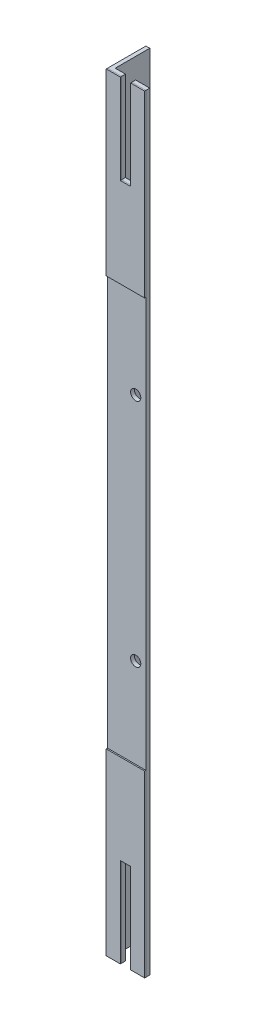
ISO-10303-21;
HEADER;
FILE_DESCRIPTION(('STEP AP214'),'2;1');
FILE_NAME('part.step','',(''),(''),'','','');
FILE_SCHEMA(('AUTOMOTIVE_DESIGN { 1 0 10303 214 1 1 1 1 }'));
ENDSEC;
DATA;
#1=APPLICATION_CONTEXT('core data for automotive mechanical design processes');
#2=APPLICATION_PROTOCOL_DEFINITION('international standard','automotive_design',2000,#1);
#3=PRODUCT_CONTEXT('',#1,'mechanical');
#4=PRODUCT('Part','Part','',(#3));
#5=PRODUCT_RELATED_PRODUCT_CATEGORY('part','',(#4));
#6=PRODUCT_DEFINITION_FORMATION('','',#4);
#7=PRODUCT_DEFINITION_CONTEXT('part definition',#1,'design');
#8=PRODUCT_DEFINITION('design','',#6,#7);
#9=PRODUCT_DEFINITION_SHAPE('','',#8);
#10=(LENGTH_UNIT() NAMED_UNIT(*) SI_UNIT(.MILLI.,.METRE.));
#11=(NAMED_UNIT(*) PLANE_ANGLE_UNIT() SI_UNIT($,.RADIAN.));
#12=(NAMED_UNIT(*) SI_UNIT($,.STERADIAN.) SOLID_ANGLE_UNIT());
#13=UNCERTAINTY_MEASURE_WITH_UNIT(LENGTH_MEASURE(1.E-05),#10,'distance_accuracy_value','');
#14=(GEOMETRIC_REPRESENTATION_CONTEXT(3) GLOBAL_UNCERTAINTY_ASSIGNED_CONTEXT((#13)) GLOBAL_UNIT_ASSIGNED_CONTEXT((#10,
#11,#12)) REPRESENTATION_CONTEXT('',''));
#15=CARTESIAN_POINT('',(0.,0.,0.));
#16=DIRECTION('',(0.,0.,1.));
#17=DIRECTION('',(1.,0.,0.));
#18=AXIS2_PLACEMENT_3D('',#15,#16,#17);
#19=CARTESIAN_POINT('',(30.,160.,1.));
#20=DIRECTION('',(-1.,0.,0.));
#21=DIRECTION('',(0.,0.,1.));
#22=AXIS2_PLACEMENT_3D('',#19,#20,#21);
#23=PLANE('',#22);
#24=DIRECTION('',(0.,1.,0.));
#25=VECTOR('',#24,1.);
#26=CARTESIAN_POINT('',(30.,160.,0.));
#27=LINE('',#26,#25);
#28=CARTESIAN_POINT('',(30.,160.,0.));
#29=VERTEX_POINT('',#28);
#30=CARTESIAN_POINT('',(30.,300.,0.));
#31=VERTEX_POINT('',#30);
#32=EDGE_CURVE('E144',#29,#31,#27,.T.);
#33=ORIENTED_EDGE('',*,*,#32,.T.);
#34=DIRECTION('',(0.,0.,-1.));
#35=VECTOR('',#34,1.);
#36=CARTESIAN_POINT('',(30.,300.,1.));
#37=LINE('',#36,#35);
#38=CARTESIAN_POINT('',(30.,300.,1.));
#39=VERTEX_POINT('',#38);
#40=EDGE_CURVE('E12',#39,#31,#37,.T.);
#41=ORIENTED_EDGE('',*,*,#40,.F.);
#42=DIRECTION('',(0.,1.,0.));
#43=VECTOR('',#42,1.);
#44=CARTESIAN_POINT('',(30.,160.,1.));
#45=LINE('',#44,#43);
#46=CARTESIAN_POINT('',(30.,160.,1.));
#47=VERTEX_POINT('',#46);
#48=EDGE_CURVE('E158',#47,#39,#45,.T.);
#49=ORIENTED_EDGE('',*,*,#48,.F.);
#50=DIRECTION('',(0.,0.,-1.));
#51=VECTOR('',#50,1.);
#52=CARTESIAN_POINT('',(30.,160.,1.));
#53=LINE('',#52,#51);
#54=EDGE_CURVE('E140',#47,#29,#53,.T.);
#55=ORIENTED_EDGE('',*,*,#54,.T.);
#56=EDGE_LOOP('',(#33,#41,#49,#55));
#57=FACE_BOUND('',#56,.T.);
#58=ADVANCED_FACE('F48',(#57),#23,.F.);
#59=CARTESIAN_POINT('',(30.,300.,1.));
#60=DIRECTION('',(0.,-1.,0.));
#61=DIRECTION('',(0.,0.,-1.));
#62=AXIS2_PLACEMENT_3D('',#59,#60,#61);
#63=PLANE('',#62);
#64=DIRECTION('',(-1.,0.,0.));
#65=VECTOR('',#64,1.);
#66=CARTESIAN_POINT('',(30.,300.,0.));
#67=LINE('',#66,#65);
#68=CARTESIAN_POINT('',(19.,300.,0.));
#69=VERTEX_POINT('',#68);
#70=EDGE_CURVE('E147',#31,#69,#67,.T.);
#71=ORIENTED_EDGE('',*,*,#70,.T.);
#72=DIRECTION('',(0.,0.,-1.));
#73=VECTOR('',#72,1.);
#74=CARTESIAN_POINT('',(19.,300.,1.));
#75=LINE('',#74,#73);
#76=CARTESIAN_POINT('',(19.,300.,1.));
#77=VERTEX_POINT('',#76);
#78=EDGE_CURVE('E56',#77,#69,#75,.T.);
#79=ORIENTED_EDGE('',*,*,#78,.F.);
#80=DIRECTION('',(-1.,0.,0.));
#81=VECTOR('',#80,1.);
#82=CARTESIAN_POINT('',(30.,300.,1.));
#83=LINE('',#82,#81);
#84=EDGE_CURVE('E107',#39,#77,#83,.T.);
#85=ORIENTED_EDGE('',*,*,#84,.F.);
#86=ORIENTED_EDGE('',*,*,#40,.T.);
#87=EDGE_LOOP('',(#71,#79,#85,#86));
#88=FACE_BOUND('',#87,.T.);
#89=ADVANCED_FACE('F193',(#88),#63,.F.);
#90=CARTESIAN_POINT('',(19.,300.,1.));
#91=DIRECTION('',(1.,0.,0.));
#92=DIRECTION('',(0.,0.,-1.));
#93=AXIS2_PLACEMENT_3D('',#90,#91,#92);
#94=PLANE('',#93);
#95=DIRECTION('',(0.,-1.,0.));
#96=VECTOR('',#95,1.);
#97=CARTESIAN_POINT('',(19.,300.,0.));
#98=LINE('',#97,#96);
#99=CARTESIAN_POINT('',(19.,230.,0.));
#100=VERTEX_POINT('',#99);
#101=EDGE_CURVE('E149',#69,#100,#98,.T.);
#102=ORIENTED_EDGE('',*,*,#101,.T.);
#103=DIRECTION('',(0.,0.,-1.));
#104=VECTOR('',#103,1.);
#105=CARTESIAN_POINT('',(19.,230.,1.));
#106=LINE('',#105,#104);
#107=CARTESIAN_POINT('',(19.,230.,1.));
#108=VERTEX_POINT('',#107);
#109=EDGE_CURVE('E165',#108,#100,#106,.T.);
#110=ORIENTED_EDGE('',*,*,#109,.F.);
#111=DIRECTION('',(0.,-1.,0.));
#112=VECTOR('',#111,1.);
#113=CARTESIAN_POINT('',(19.,300.,1.));
#114=LINE('',#113,#112);
#115=EDGE_CURVE('E173',#77,#108,#114,.T.);
#116=ORIENTED_EDGE('',*,*,#115,.F.);
#117=ORIENTED_EDGE('',*,*,#78,.T.);
#118=EDGE_LOOP('',(#102,#110,#116,#117));
#119=FACE_BOUND('',#118,.T.);
#120=ADVANCED_FACE('F171',(#119),#94,.F.);
#121=CARTESIAN_POINT('',(19.,230.,1.));
#122=DIRECTION('',(0.,-1.,0.));
#123=DIRECTION('',(0.,0.,-1.));
#124=AXIS2_PLACEMENT_3D('',#121,#122,#123);
#125=PLANE('',#124);
#126=DIRECTION('',(-1.,0.,0.));
#127=VECTOR('',#126,1.);
#128=CARTESIAN_POINT('',(19.,230.,0.));
#129=LINE('',#128,#127);
#130=CARTESIAN_POINT('',(11.,230.,0.));
#131=VERTEX_POINT('',#130);
#132=EDGE_CURVE('E151',#100,#131,#129,.T.);
#133=ORIENTED_EDGE('',*,*,#132,.T.);
#134=DIRECTION('',(0.,0.,-1.));
#135=VECTOR('',#134,1.);
#136=CARTESIAN_POINT('',(11.,230.,1.));
#137=LINE('',#136,#135);
#138=CARTESIAN_POINT('',(11.,230.,1.));
#139=VERTEX_POINT('',#138);
#140=EDGE_CURVE('E162',#139,#131,#137,.T.);
#141=ORIENTED_EDGE('',*,*,#140,.F.);
#142=DIRECTION('',(-1.,0.,0.));
#143=VECTOR('',#142,1.);
#144=CARTESIAN_POINT('',(19.,230.,1.));
#145=LINE('',#144,#143);
#146=EDGE_CURVE('E185',#108,#139,#145,.T.);
#147=ORIENTED_EDGE('',*,*,#146,.F.);
#148=ORIENTED_EDGE('',*,*,#109,.T.);
#149=EDGE_LOOP('',(#133,#141,#147,#148));
#150=FACE_BOUND('',#149,.T.);
#151=ADVANCED_FACE('F181',(#150),#125,.F.);
#152=CARTESIAN_POINT('',(11.,230.,1.));
#153=DIRECTION('',(-1.,0.,0.));
#154=DIRECTION('',(0.,-1.,0.));
#155=AXIS2_PLACEMENT_3D('',#152,#153,#154);
#156=PLANE('',#155);
#157=DIRECTION('',(0.,1.,0.));
#158=VECTOR('',#157,1.);
#159=CARTESIAN_POINT('',(11.,230.,0.));
#160=LINE('',#159,#158);
#161=CARTESIAN_POINT('',(11.,300.,0.));
#162=VERTEX_POINT('',#161);
#163=EDGE_CURVE('E153',#131,#162,#160,.T.);
#164=ORIENTED_EDGE('',*,*,#163,.T.);
#165=DIRECTION('',(0.,0.,-1.));
#166=VECTOR('',#165,1.);
#167=CARTESIAN_POINT('',(11.,300.,1.));
#168=LINE('',#167,#166);
#169=CARTESIAN_POINT('',(11.,300.,1.));
#170=VERTEX_POINT('',#169);
#171=EDGE_CURVE('E135',#170,#162,#168,.T.);
#172=ORIENTED_EDGE('',*,*,#171,.F.);
#173=DIRECTION('',(0.,1.,0.));
#174=VECTOR('',#173,1.);
#175=CARTESIAN_POINT('',(11.,230.,1.));
#176=LINE('',#175,#174);
#177=EDGE_CURVE('E126',#139,#170,#176,.T.);
#178=ORIENTED_EDGE('',*,*,#177,.F.);
#179=ORIENTED_EDGE('',*,*,#140,.T.);
#180=EDGE_LOOP('',(#164,#172,#178,#179));
#181=FACE_BOUND('',#180,.T.);
#182=ADVANCED_FACE('F184',(#181),#156,.F.);
#183=CARTESIAN_POINT('',(11.,300.,1.));
#184=DIRECTION('',(0.,-1.,0.));
#185=DIRECTION('',(0.,0.,-1.));
#186=AXIS2_PLACEMENT_3D('',#183,#184,#185);
#187=PLANE('',#186);
#188=DIRECTION('',(-1.,0.,0.));
#189=VECTOR('',#188,1.);
#190=CARTESIAN_POINT('',(11.,300.,0.));
#191=LINE('',#190,#189);
#192=CARTESIAN_POINT('',(0.,300.,0.));
#193=VERTEX_POINT('',#192);
#194=EDGE_CURVE('E134',#162,#193,#191,.T.);
#195=ORIENTED_EDGE('',*,*,#194,.T.);
#196=DIRECTION('',(0.,0.,-1.));
#197=VECTOR('',#196,1.);
#198=CARTESIAN_POINT('',(0.,300.,1.));
#199=LINE('',#198,#197);
#200=CARTESIAN_POINT('',(0.,300.,1.));
#201=VERTEX_POINT('',#200);
#202=EDGE_CURVE('E131',#201,#193,#199,.T.);
#203=ORIENTED_EDGE('',*,*,#202,.F.);
#204=DIRECTION('',(-1.,0.,0.));
#205=VECTOR('',#204,1.);
#206=CARTESIAN_POINT('',(11.,300.,1.));
#207=LINE('',#206,#205);
#208=EDGE_CURVE('E120',#170,#201,#207,.T.);
#209=ORIENTED_EDGE('',*,*,#208,.F.);
#210=ORIENTED_EDGE('',*,*,#171,.T.);
#211=EDGE_LOOP('',(#195,#203,#209,#210));
#212=FACE_BOUND('',#211,.T.);
#213=ADVANCED_FACE('F132',(#212),#187,.F.);
#214=CARTESIAN_POINT('',(0.,300.,1.));
#215=DIRECTION('',(1.,0.,0.));
#216=DIRECTION('',(0.,1.,0.));
#217=AXIS2_PLACEMENT_3D('',#214,#215,#216);
#218=PLANE('',#217);
#219=DIRECTION('',(0.,-1.,0.));
#220=VECTOR('',#219,1.);
#221=CARTESIAN_POINT('',(0.,300.,0.));
#222=LINE('',#221,#220);
#223=CARTESIAN_POINT('',(0.,160.,0.));
#224=VERTEX_POINT('',#223);
#225=EDGE_CURVE('E93',#193,#224,#222,.T.);
#226=ORIENTED_EDGE('',*,*,#225,.T.);
#227=DIRECTION('',(0.,0.,-1.));
#228=VECTOR('',#227,1.);
#229=CARTESIAN_POINT('',(0.,160.,1.));
#230=LINE('',#229,#228);
#231=CARTESIAN_POINT('',(0.,160.,1.));
#232=VERTEX_POINT('',#231);
#233=EDGE_CURVE('E136',#232,#224,#230,.T.);
#234=ORIENTED_EDGE('',*,*,#233,.F.);
#235=DIRECTION('',(0.,-1.,0.));
#236=VECTOR('',#235,1.);
#237=CARTESIAN_POINT('',(0.,300.,1.));
#238=LINE('',#237,#236);
#239=EDGE_CURVE('E124',#201,#232,#238,.T.);
#240=ORIENTED_EDGE('',*,*,#239,.F.);
#241=ORIENTED_EDGE('',*,*,#202,.T.);
#242=EDGE_LOOP('',(#226,#234,#240,#241));
#243=FACE_BOUND('',#242,.T.);
#244=ADVANCED_FACE('F138',(#243),#218,.F.);
#245=CARTESIAN_POINT('',(0.,160.,1.));
#246=DIRECTION('',(0.,1.,0.));
#247=DIRECTION('',(0.,0.,1.));
#248=AXIS2_PLACEMENT_3D('',#245,#246,#247);
#249=PLANE('',#248);
#250=DIRECTION('',(1.,0.,0.));
#251=VECTOR('',#250,1.);
#252=CARTESIAN_POINT('',(0.,160.,0.));
#253=LINE('',#252,#251);
#254=EDGE_CURVE('E99',#224,#29,#253,.T.);
#255=ORIENTED_EDGE('',*,*,#254,.T.);
#256=ORIENTED_EDGE('',*,*,#54,.F.);
#257=DIRECTION('',(1.,0.,0.));
#258=VECTOR('',#257,1.);
#259=CARTESIAN_POINT('',(0.,160.,1.));
#260=LINE('',#259,#258);
#261=EDGE_CURVE('E64',#232,#47,#260,.T.);
#262=ORIENTED_EDGE('',*,*,#261,.F.);
#263=ORIENTED_EDGE('',*,*,#233,.T.);
#264=EDGE_LOOP('',(#255,#256,#262,#263));
#265=FACE_BOUND('',#264,.T.);
#266=ADVANCED_FACE('F209',(#265),#249,.F.);
#267=CARTESIAN_POINT('',(0.,0.,1.));
#268=DIRECTION('',(0.,0.,1.));
#269=DIRECTION('',(1.,0.,0.));
#270=AXIS2_PLACEMENT_3D('',#267,#268,#269);
#271=PLANE('',#270);
#272=ORIENTED_EDGE('',*,*,#48,.T.);
#273=ORIENTED_EDGE('',*,*,#84,.T.);
#274=ORIENTED_EDGE('',*,*,#115,.T.);
#275=ORIENTED_EDGE('',*,*,#146,.T.);
#276=ORIENTED_EDGE('',*,*,#177,.T.);
#277=ORIENTED_EDGE('',*,*,#208,.T.);
#278=ORIENTED_EDGE('',*,*,#239,.T.);
#279=ORIENTED_EDGE('',*,*,#261,.T.);
#280=EDGE_LOOP('',(#272,#273,#274,#275,#276,#277,#278,#279));
#281=FACE_BOUND('',#280,.T.);
#282=ADVANCED_FACE('F122',(#281),#271,.T.);
#283=CARTESIAN_POINT('',(0.,0.,0.));
#284=DIRECTION('',(0.,0.,1.));
#285=DIRECTION('',(1.,0.,0.));
#286=AXIS2_PLACEMENT_3D('',#283,#284,#285);
#287=PLANE('',#286);
#288=ORIENTED_EDGE('',*,*,#32,.F.);
#289=ORIENTED_EDGE('',*,*,#254,.F.);
#290=ORIENTED_EDGE('',*,*,#225,.F.);
#291=ORIENTED_EDGE('',*,*,#194,.F.);
#292=ORIENTED_EDGE('',*,*,#163,.F.);
#293=ORIENTED_EDGE('',*,*,#132,.F.);
#294=ORIENTED_EDGE('',*,*,#101,.F.);
#295=ORIENTED_EDGE('',*,*,#70,.F.);
#296=EDGE_LOOP('',(#288,#289,#290,#291,#292,#293,#294,#295));
#297=FACE_BOUND('',#296,.T.);
#298=ADVANCED_FACE('F177',(#297),#287,.F.);
#299=CLOSED_SHELL('',(#58,#89,#120,#151,#182,#213,#244,#266,#282,#298));
#300=MANIFOLD_SOLID_BREP('B2',#299);
#301=CARTESIAN_POINT('',(30.,-160.,1.));
#302=DIRECTION('',(0.,-1.,0.));
#303=DIRECTION('',(0.,0.,-1.));
#304=AXIS2_PLACEMENT_3D('',#301,#302,#303);
#305=PLANE('',#304);
#306=DIRECTION('',(-1.,0.,0.));
#307=VECTOR('',#306,1.);
#308=CARTESIAN_POINT('',(30.,-160.,0.));
#309=LINE('',#308,#307);
#310=CARTESIAN_POINT('',(30.,-160.,0.));
#311=VERTEX_POINT('',#310);
#312=CARTESIAN_POINT('',(0.,-160.,0.));
#313=VERTEX_POINT('',#312);
#314=EDGE_CURVE('E381',#311,#313,#309,.T.);
#315=ORIENTED_EDGE('',*,*,#314,.T.);
#316=DIRECTION('',(0.,0.,-1.));
#317=VECTOR('',#316,1.);
#318=CARTESIAN_POINT('',(0.,-160.,1.));
#319=LINE('',#318,#317);
#320=CARTESIAN_POINT('',(0.,-160.,1.));
#321=VERTEX_POINT('',#320);
#322=EDGE_CURVE('E46',#321,#313,#319,.T.);
#323=ORIENTED_EDGE('',*,*,#322,.F.);
#324=DIRECTION('',(-1.,0.,0.));
#325=VECTOR('',#324,1.);
#326=CARTESIAN_POINT('',(30.,-160.,1.));
#327=LINE('',#326,#325);
#328=CARTESIAN_POINT('',(30.,-160.,1.));
#329=VERTEX_POINT('',#328);
#330=EDGE_CURVE('E395',#329,#321,#327,.T.);
#331=ORIENTED_EDGE('',*,*,#330,.F.);
#332=DIRECTION('',(0.,0.,-1.));
#333=VECTOR('',#332,1.);
#334=CARTESIAN_POINT('',(30.,-160.,1.));
#335=LINE('',#334,#333);
#336=EDGE_CURVE('E377',#329,#311,#335,.T.);
#337=ORIENTED_EDGE('',*,*,#336,.T.);
#338=EDGE_LOOP('',(#315,#323,#331,#337));
#339=FACE_BOUND('',#338,.T.);
#340=ADVANCED_FACE('F285',(#339),#305,.F.);
#341=CARTESIAN_POINT('',(0.,-160.,1.));
#342=DIRECTION('',(1.,0.,0.));
#343=DIRECTION('',(0.,1.,0.));
#344=AXIS2_PLACEMENT_3D('',#341,#342,#343);
#345=PLANE('',#344);
#346=DIRECTION('',(0.,-1.,0.));
#347=VECTOR('',#346,1.);
#348=CARTESIAN_POINT('',(0.,-160.,0.));
#349=LINE('',#348,#347);
#350=CARTESIAN_POINT('',(0.,-300.,0.));
#351=VERTEX_POINT('',#350);
#352=EDGE_CURVE('E384',#313,#351,#349,.T.);
#353=ORIENTED_EDGE('',*,*,#352,.T.);
#354=DIRECTION('',(0.,0.,-1.));
#355=VECTOR('',#354,1.);
#356=CARTESIAN_POINT('',(0.,-300.,1.));
#357=LINE('',#356,#355);
#358=CARTESIAN_POINT('',(0.,-300.,1.));
#359=VERTEX_POINT('',#358);
#360=EDGE_CURVE('E293',#359,#351,#357,.T.);
#361=ORIENTED_EDGE('',*,*,#360,.F.);
#362=DIRECTION('',(0.,-1.,0.));
#363=VECTOR('',#362,1.);
#364=CARTESIAN_POINT('',(0.,-160.,1.));
#365=LINE('',#364,#363);
#366=EDGE_CURVE('E344',#321,#359,#365,.T.);
#367=ORIENTED_EDGE('',*,*,#366,.F.);
#368=ORIENTED_EDGE('',*,*,#322,.T.);
#369=EDGE_LOOP('',(#353,#361,#367,#368));
#370=FACE_BOUND('',#369,.T.);
#371=ADVANCED_FACE('F430',(#370),#345,.F.);
#372=CARTESIAN_POINT('',(0.,-300.,1.));
#373=DIRECTION('',(0.,1.,0.));
#374=DIRECTION('',(0.,0.,1.));
#375=AXIS2_PLACEMENT_3D('',#372,#373,#374);
#376=PLANE('',#375);
#377=DIRECTION('',(1.,0.,0.));
#378=VECTOR('',#377,1.);
#379=CARTESIAN_POINT('',(0.,-300.,0.));
#380=LINE('',#379,#378);
#381=CARTESIAN_POINT('',(11.,-300.,0.));
#382=VERTEX_POINT('',#381);
#383=EDGE_CURVE('E386',#351,#382,#380,.T.);
#384=ORIENTED_EDGE('',*,*,#383,.T.);
#385=DIRECTION('',(0.,0.,-1.));
#386=VECTOR('',#385,1.);
#387=CARTESIAN_POINT('',(11.,-300.,1.));
#388=LINE('',#387,#386);
#389=CARTESIAN_POINT('',(11.,-300.,1.));
#390=VERTEX_POINT('',#389);
#391=EDGE_CURVE('E402',#390,#382,#388,.T.);
#392=ORIENTED_EDGE('',*,*,#391,.F.);
#393=DIRECTION('',(1.,0.,0.));
#394=VECTOR('',#393,1.);
#395=CARTESIAN_POINT('',(0.,-300.,1.));
#396=LINE('',#395,#394);
#397=EDGE_CURVE('E410',#359,#390,#396,.T.);
#398=ORIENTED_EDGE('',*,*,#397,.F.);
#399=ORIENTED_EDGE('',*,*,#360,.T.);
#400=EDGE_LOOP('',(#384,#392,#398,#399));
#401=FACE_BOUND('',#400,.T.);
#402=ADVANCED_FACE('F408',(#401),#376,.F.);
#403=CARTESIAN_POINT('',(11.,-300.,1.));
#404=DIRECTION('',(-1.,0.,0.));
#405=DIRECTION('',(0.,-1.,0.));
#406=AXIS2_PLACEMENT_3D('',#403,#404,#405);
#407=PLANE('',#406);
#408=DIRECTION('',(0.,1.,0.));
#409=VECTOR('',#408,1.);
#410=CARTESIAN_POINT('',(11.,-300.,0.));
#411=LINE('',#410,#409);
#412=CARTESIAN_POINT('',(11.,-230.,0.));
#413=VERTEX_POINT('',#412);
#414=EDGE_CURVE('E388',#382,#413,#411,.T.);
#415=ORIENTED_EDGE('',*,*,#414,.T.);
#416=DIRECTION('',(0.,0.,-1.));
#417=VECTOR('',#416,1.);
#418=CARTESIAN_POINT('',(11.,-230.,1.));
#419=LINE('',#418,#417);
#420=CARTESIAN_POINT('',(11.,-230.,1.));
#421=VERTEX_POINT('',#420);
#422=EDGE_CURVE('E399',#421,#413,#419,.T.);
#423=ORIENTED_EDGE('',*,*,#422,.F.);
#424=DIRECTION('',(0.,1.,0.));
#425=VECTOR('',#424,1.);
#426=CARTESIAN_POINT('',(11.,-300.,1.));
#427=LINE('',#426,#425);
#428=EDGE_CURVE('E422',#390,#421,#427,.T.);
#429=ORIENTED_EDGE('',*,*,#428,.F.);
#430=ORIENTED_EDGE('',*,*,#391,.T.);
#431=EDGE_LOOP('',(#415,#423,#429,#430));
#432=FACE_BOUND('',#431,.T.);
#433=ADVANCED_FACE('F418',(#432),#407,.F.);
#434=CARTESIAN_POINT('',(11.,-230.,1.));
#435=DIRECTION('',(0.,1.,0.));
#436=DIRECTION('',(0.,0.,1.));
#437=AXIS2_PLACEMENT_3D('',#434,#435,#436);
#438=PLANE('',#437);
#439=DIRECTION('',(1.,0.,0.));
#440=VECTOR('',#439,1.);
#441=CARTESIAN_POINT('',(11.,-230.,0.));
#442=LINE('',#441,#440);
#443=CARTESIAN_POINT('',(19.,-230.,0.));
#444=VERTEX_POINT('',#443);
#445=EDGE_CURVE('E390',#413,#444,#442,.T.);
#446=ORIENTED_EDGE('',*,*,#445,.T.);
#447=DIRECTION('',(0.,0.,-1.));
#448=VECTOR('',#447,1.);
#449=CARTESIAN_POINT('',(19.,-230.,1.));
#450=LINE('',#449,#448);
#451=CARTESIAN_POINT('',(19.,-230.,1.));
#452=VERTEX_POINT('',#451);
#453=EDGE_CURVE('E372',#452,#444,#450,.T.);
#454=ORIENTED_EDGE('',*,*,#453,.F.);
#455=DIRECTION('',(1.,0.,0.));
#456=VECTOR('',#455,1.);
#457=CARTESIAN_POINT('',(11.,-230.,1.));
#458=LINE('',#457,#456);
#459=EDGE_CURVE('E363',#421,#452,#458,.T.);
#460=ORIENTED_EDGE('',*,*,#459,.F.);
#461=ORIENTED_EDGE('',*,*,#422,.T.);
#462=EDGE_LOOP('',(#446,#454,#460,#461));
#463=FACE_BOUND('',#462,.T.);
#464=ADVANCED_FACE('F421',(#463),#438,.F.);
#465=CARTESIAN_POINT('',(19.,-230.,1.));
#466=DIRECTION('',(1.,0.,0.));
#467=DIRECTION('',(0.,1.,0.));
#468=AXIS2_PLACEMENT_3D('',#465,#466,#467);
#469=PLANE('',#468);
#470=DIRECTION('',(0.,-1.,0.));
#471=VECTOR('',#470,1.);
#472=CARTESIAN_POINT('',(19.,-230.,0.));
#473=LINE('',#472,#471);
#474=CARTESIAN_POINT('',(19.,-300.,0.));
#475=VERTEX_POINT('',#474);
#476=EDGE_CURVE('E371',#444,#475,#473,.T.);
#477=ORIENTED_EDGE('',*,*,#476,.T.);
#478=DIRECTION('',(0.,0.,-1.));
#479=VECTOR('',#478,1.);
#480=CARTESIAN_POINT('',(19.,-300.,1.));
#481=LINE('',#480,#479);
#482=CARTESIAN_POINT('',(19.,-300.,1.));
#483=VERTEX_POINT('',#482);
#484=EDGE_CURVE('E368',#483,#475,#481,.T.);
#485=ORIENTED_EDGE('',*,*,#484,.F.);
#486=DIRECTION('',(0.,-1.,0.));
#487=VECTOR('',#486,1.);
#488=CARTESIAN_POINT('',(19.,-230.,1.));
#489=LINE('',#488,#487);
#490=EDGE_CURVE('E357',#452,#483,#489,.T.);
#491=ORIENTED_EDGE('',*,*,#490,.F.);
#492=ORIENTED_EDGE('',*,*,#453,.T.);
#493=EDGE_LOOP('',(#477,#485,#491,#492));
#494=FACE_BOUND('',#493,.T.);
#495=ADVANCED_FACE('F369',(#494),#469,.F.);
#496=CARTESIAN_POINT('',(19.,-300.,1.));
#497=DIRECTION('',(0.,1.,0.));
#498=DIRECTION('',(0.,0.,1.));
#499=AXIS2_PLACEMENT_3D('',#496,#497,#498);
#500=PLANE('',#499);
#501=DIRECTION('',(1.,0.,0.));
#502=VECTOR('',#501,1.);
#503=CARTESIAN_POINT('',(19.,-300.,0.));
#504=LINE('',#503,#502);
#505=CARTESIAN_POINT('',(30.,-300.,0.));
#506=VERTEX_POINT('',#505);
#507=EDGE_CURVE('E330',#475,#506,#504,.T.);
#508=ORIENTED_EDGE('',*,*,#507,.T.);
#509=DIRECTION('',(0.,0.,-1.));
#510=VECTOR('',#509,1.);
#511=CARTESIAN_POINT('',(30.,-300.,1.));
#512=LINE('',#511,#510);
#513=CARTESIAN_POINT('',(30.,-300.,1.));
#514=VERTEX_POINT('',#513);
#515=EDGE_CURVE('E373',#514,#506,#512,.T.);
#516=ORIENTED_EDGE('',*,*,#515,.F.);
#517=DIRECTION('',(1.,0.,0.));
#518=VECTOR('',#517,1.);
#519=CARTESIAN_POINT('',(19.,-300.,1.));
#520=LINE('',#519,#518);
#521=EDGE_CURVE('E361',#483,#514,#520,.T.);
#522=ORIENTED_EDGE('',*,*,#521,.F.);
#523=ORIENTED_EDGE('',*,*,#484,.T.);
#524=EDGE_LOOP('',(#508,#516,#522,#523));
#525=FACE_BOUND('',#524,.T.);
#526=ADVANCED_FACE('F375',(#525),#500,.F.);
#527=CARTESIAN_POINT('',(30.,-300.,1.));
#528=DIRECTION('',(-1.,0.,0.));
#529=DIRECTION('',(0.,0.,1.));
#530=AXIS2_PLACEMENT_3D('',#527,#528,#529);
#531=PLANE('',#530);
#532=DIRECTION('',(0.,1.,0.));
#533=VECTOR('',#532,1.);
#534=CARTESIAN_POINT('',(30.,-300.,0.));
#535=LINE('',#534,#533);
#536=EDGE_CURVE('E336',#506,#311,#535,.T.);
#537=ORIENTED_EDGE('',*,*,#536,.T.);
#538=ORIENTED_EDGE('',*,*,#336,.F.);
#539=DIRECTION('',(0.,1.,0.));
#540=VECTOR('',#539,1.);
#541=CARTESIAN_POINT('',(30.,-300.,1.));
#542=LINE('',#541,#540);
#543=EDGE_CURVE('E301',#514,#329,#542,.T.);
#544=ORIENTED_EDGE('',*,*,#543,.F.);
#545=ORIENTED_EDGE('',*,*,#515,.T.);
#546=EDGE_LOOP('',(#537,#538,#544,#545));
#547=FACE_BOUND('',#546,.T.);
#548=ADVANCED_FACE('F446',(#547),#531,.F.);
#549=CARTESIAN_POINT('',(0.,0.,1.));
#550=DIRECTION('',(0.,0.,1.));
#551=DIRECTION('',(1.,0.,0.));
#552=AXIS2_PLACEMENT_3D('',#549,#550,#551);
#553=PLANE('',#552);
#554=ORIENTED_EDGE('',*,*,#330,.T.);
#555=ORIENTED_EDGE('',*,*,#366,.T.);
#556=ORIENTED_EDGE('',*,*,#397,.T.);
#557=ORIENTED_EDGE('',*,*,#428,.T.);
#558=ORIENTED_EDGE('',*,*,#459,.T.);
#559=ORIENTED_EDGE('',*,*,#490,.T.);
#560=ORIENTED_EDGE('',*,*,#521,.T.);
#561=ORIENTED_EDGE('',*,*,#543,.T.);
#562=EDGE_LOOP('',(#554,#555,#556,#557,#558,#559,#560,#561));
#563=FACE_BOUND('',#562,.T.);
#564=ADVANCED_FACE('F359',(#563),#553,.T.);
#565=CARTESIAN_POINT('',(0.,0.,0.));
#566=DIRECTION('',(0.,0.,1.));
#567=DIRECTION('',(1.,0.,0.));
#568=AXIS2_PLACEMENT_3D('',#565,#566,#567);
#569=PLANE('',#568);
#570=ORIENTED_EDGE('',*,*,#314,.F.);
#571=ORIENTED_EDGE('',*,*,#536,.F.);
#572=ORIENTED_EDGE('',*,*,#507,.F.);
#573=ORIENTED_EDGE('',*,*,#476,.F.);
#574=ORIENTED_EDGE('',*,*,#445,.F.);
#575=ORIENTED_EDGE('',*,*,#414,.F.);
#576=ORIENTED_EDGE('',*,*,#383,.F.);
#577=ORIENTED_EDGE('',*,*,#352,.F.);
#578=EDGE_LOOP('',(#570,#571,#572,#573,#574,#575,#576,#577));
#579=FACE_BOUND('',#578,.T.);
#580=ADVANCED_FACE('F414',(#579),#569,.F.);
#581=CLOSED_SHELL('',(#340,#371,#402,#433,#464,#495,#526,#548,#564,#580));
#582=MANIFOLD_SOLID_BREP('B6',#581);
#583=CARTESIAN_POINT('',(0.,-300.,0.));
#584=DIRECTION('',(0.,-1.,0.));
#585=DIRECTION('',(-1.,0.,0.));
#586=AXIS2_PLACEMENT_3D('',#583,#584,#585);
#587=PLANE('',#586);
#588=DIRECTION('',(0.,0.,-1.));
#589=VECTOR('',#588,1.);
#590=CARTESIAN_POINT('',(11.,-300.,0.));
#591=LINE('',#590,#589);
#592=CARTESIAN_POINT('',(11.,-300.,0.));
#593=VERTEX_POINT('',#592);
#594=CARTESIAN_POINT('',(11.,-300.,-3.));
#595=VERTEX_POINT('',#594);
#596=EDGE_CURVE('E521',#593,#595,#591,.T.);
#597=ORIENTED_EDGE('',*,*,#596,.F.);
#598=DIRECTION('',(1.,0.,0.));
#599=VECTOR('',#598,1.);
#600=CARTESIAN_POINT('',(0.,-300.,0.));
#601=LINE('',#600,#599);
#602=CARTESIAN_POINT('',(0.,-300.,0.));
#603=VERTEX_POINT('',#602);
#604=EDGE_CURVE('E635',#603,#593,#601,.T.);
#605=ORIENTED_EDGE('',*,*,#604,.F.);
#606=DIRECTION('',(0.,0.,1.));
#607=VECTOR('',#606,1.);
#608=CARTESIAN_POINT('',(0.,-300.,-30.));
#609=LINE('',#608,#607);
#610=CARTESIAN_POINT('',(0.,-300.,-30.));
#611=VERTEX_POINT('',#610);
#612=EDGE_CURVE('E655',#611,#603,#609,.T.);
#613=ORIENTED_EDGE('',*,*,#612,.F.);
#614=DIRECTION('',(1.,0.,0.));
#615=VECTOR('',#614,1.);
#616=CARTESIAN_POINT('',(0.,-300.,-30.));
#617=LINE('',#616,#615);
#618=CARTESIAN_POINT('',(3.,-300.,-30.));
#619=VERTEX_POINT('',#618);
#620=EDGE_CURVE('E652',#611,#619,#617,.T.);
#621=ORIENTED_EDGE('',*,*,#620,.T.);
#622=DIRECTION('',(0.,0.,-1.));
#623=VECTOR('',#622,1.);
#624=CARTESIAN_POINT('',(3.,-300.,-30.));
#625=LINE('',#624,#623);
#626=CARTESIAN_POINT('',(3.,-300.,-3.));
#627=VERTEX_POINT('',#626);
#628=EDGE_CURVE('E649',#619,#627,#625,.F.);
#629=ORIENTED_EDGE('',*,*,#628,.T.);
#630=DIRECTION('',(1.,0.,0.));
#631=VECTOR('',#630,1.);
#632=CARTESIAN_POINT('',(0.,-300.,-3.));
#633=LINE('',#632,#631);
#634=EDGE_CURVE('E646',#627,#595,#633,.T.);
#635=ORIENTED_EDGE('',*,*,#634,.T.);
#636=EDGE_LOOP('',(#597,#605,#613,#621,#629,#635));
#637=FACE_BOUND('',#636,.T.);
#638=ADVANCED_FACE('F513',(#637),#587,.T.);
#639=CARTESIAN_POINT('',(0.,300.,0.));
#640=DIRECTION('',(0.,-1.,0.));
#641=DIRECTION('',(-1.,0.,0.));
#642=AXIS2_PLACEMENT_3D('',#639,#640,#641);
#643=PLANE('',#642);
#644=DIRECTION('',(1.,0.,0.));
#645=VECTOR('',#644,1.);
#646=CARTESIAN_POINT('',(0.,300.,0.));
#647=LINE('',#646,#645);
#648=CARTESIAN_POINT('',(0.,300.,0.));
#649=VERTEX_POINT('',#648);
#650=CARTESIAN_POINT('',(11.,300.,0.));
#651=VERTEX_POINT('',#650);
#652=EDGE_CURVE('E729',#649,#651,#647,.T.);
#653=ORIENTED_EDGE('',*,*,#652,.T.);
#654=DIRECTION('',(0.,0.,-1.));
#655=VECTOR('',#654,1.);
#656=CARTESIAN_POINT('',(11.,300.,0.));
#657=LINE('',#656,#655);
#658=CARTESIAN_POINT('',(11.,300.,-3.));
#659=VERTEX_POINT('',#658);
#660=EDGE_CURVE('E674',#651,#659,#657,.T.);
#661=ORIENTED_EDGE('',*,*,#660,.T.);
#662=DIRECTION('',(1.,0.,0.));
#663=VECTOR('',#662,1.);
#664=CARTESIAN_POINT('',(0.,300.,-3.));
#665=LINE('',#664,#663);
#666=CARTESIAN_POINT('',(3.,300.,-3.));
#667=VERTEX_POINT('',#666);
#668=EDGE_CURVE('E712',#667,#659,#665,.T.);
#669=ORIENTED_EDGE('',*,*,#668,.F.);
#670=DIRECTION('',(0.,0.,-1.));
#671=VECTOR('',#670,1.);
#672=CARTESIAN_POINT('',(3.,300.,-30.));
#673=LINE('',#672,#671);
#674=CARTESIAN_POINT('',(3.,300.,-30.));
#675=VERTEX_POINT('',#674);
#676=EDGE_CURVE('E708',#675,#667,#673,.F.);
#677=ORIENTED_EDGE('',*,*,#676,.F.);
#678=DIRECTION('',(1.,0.,0.));
#679=VECTOR('',#678,1.);
#680=CARTESIAN_POINT('',(0.,300.,-30.));
#681=LINE('',#680,#679);
#682=CARTESIAN_POINT('',(0.,300.,-30.));
#683=VERTEX_POINT('',#682);
#684=EDGE_CURVE('E720',#683,#675,#681,.T.);
#685=ORIENTED_EDGE('',*,*,#684,.F.);
#686=DIRECTION('',(0.,0.,1.));
#687=VECTOR('',#686,1.);
#688=CARTESIAN_POINT('',(0.,300.,-30.));
#689=LINE('',#688,#687);
#690=EDGE_CURVE('E642',#683,#649,#689,.T.);
#691=ORIENTED_EDGE('',*,*,#690,.T.);
#692=EDGE_LOOP('',(#653,#661,#669,#677,#685,#691));
#693=FACE_BOUND('',#692,.T.);
#694=ADVANCED_FACE('F715',(#693),#643,.F.);
#695=CARTESIAN_POINT('',(0.,300.,0.));
#696=DIRECTION('',(0.,0.,-1.));
#697=DIRECTION('',(-1.,0.,0.));
#698=AXIS2_PLACEMENT_3D('',#695,#696,#697);
#699=PLANE('',#698);
#700=CARTESIAN_POINT('',(21.9999999999999,-90.,0.));
#701=DIRECTION('',(0.,0.,1.));
#702=DIRECTION('',(-1.,0.,0.));
#703=AXIS2_PLACEMENT_3D('',#700,#701,#702);
#704=CIRCLE('',#703,4.);
#705=CARTESIAN_POINT('',(17.9999999999999,-90.,0.));
#706=VERTEX_POINT('',#705);
#707=EDGE_CURVE('E685',#706,#706,#704,.T.);
#708=ORIENTED_EDGE('',*,*,#707,.F.);
#709=EDGE_LOOP('',(#708));
#710=FACE_BOUND('',#709,.T.);
#711=CARTESIAN_POINT('',(21.9999999999999,90.,0.));
#712=DIRECTION('',(0.,0.,1.));
#713=DIRECTION('',(1.,0.,0.));
#714=AXIS2_PLACEMENT_3D('',#711,#712,#713);
#715=CIRCLE('',#714,4.);
#716=CARTESIAN_POINT('',(25.9999999999999,90.,0.));
#717=VERTEX_POINT('',#716);
#718=EDGE_CURVE('E682',#717,#717,#715,.T.);
#719=ORIENTED_EDGE('',*,*,#718,.F.);
#720=EDGE_LOOP('',(#719));
#721=FACE_BOUND('',#720,.T.);
#722=ORIENTED_EDGE('',*,*,#604,.T.);
#723=DIRECTION('',(0.,-1.,0.));
#724=VECTOR('',#723,1.);
#725=CARTESIAN_POINT('',(11.,-300.,0.));
#726=LINE('',#725,#724);
#727=CARTESIAN_POINT('',(11.,-230.,0.));
#728=VERTEX_POINT('',#727);
#729=EDGE_CURVE('E692',#728,#593,#726,.T.);
#730=ORIENTED_EDGE('',*,*,#729,.F.);
#731=DIRECTION('',(-1.,0.,0.));
#732=VECTOR('',#731,1.);
#733=CARTESIAN_POINT('',(11.,-230.,0.));
#734=LINE('',#733,#732);
#735=CARTESIAN_POINT('',(19.,-230.,0.));
#736=VERTEX_POINT('',#735);
#737=EDGE_CURVE('E629',#736,#728,#734,.T.);
#738=ORIENTED_EDGE('',*,*,#737,.F.);
#739=DIRECTION('',(0.,1.,0.));
#740=VECTOR('',#739,1.);
#741=CARTESIAN_POINT('',(19.,-300.,0.));
#742=LINE('',#741,#740);
#743=CARTESIAN_POINT('',(19.,-300.,0.));
#744=VERTEX_POINT('',#743);
#745=EDGE_CURVE('E615',#744,#736,#742,.T.);
#746=ORIENTED_EDGE('',*,*,#745,.F.);
#747=CARTESIAN_POINT('',(30.,-300.,0.));
#748=VERTEX_POINT('',#747);
#749=EDGE_CURVE('E625',#744,#748,#601,.T.);
#750=ORIENTED_EDGE('',*,*,#749,.T.);
#751=DIRECTION('',(0.,-1.,0.));
#752=VECTOR('',#751,1.);
#753=CARTESIAN_POINT('',(30.,300.,0.));
#754=LINE('',#753,#752);
#755=CARTESIAN_POINT('',(30.,300.,0.));
#756=VERTEX_POINT('',#755);
#757=EDGE_CURVE('E670',#756,#748,#754,.T.);
#758=ORIENTED_EDGE('',*,*,#757,.F.);
#759=CARTESIAN_POINT('',(19.,300.,0.));
#760=VERTEX_POINT('',#759);
#761=EDGE_CURVE('E657',#760,#756,#647,.T.);
#762=ORIENTED_EDGE('',*,*,#761,.F.);
#763=DIRECTION('',(0.,1.,0.));
#764=VECTOR('',#763,1.);
#765=CARTESIAN_POINT('',(19.,300.,0.));
#766=LINE('',#765,#764);
#767=CARTESIAN_POINT('',(19.,230.,0.));
#768=VERTEX_POINT('',#767);
#769=EDGE_CURVE('E536',#768,#760,#766,.T.);
#770=ORIENTED_EDGE('',*,*,#769,.F.);
#771=DIRECTION('',(1.,0.,0.));
#772=VECTOR('',#771,1.);
#773=CARTESIAN_POINT('',(11.,230.,0.));
#774=LINE('',#773,#772);
#775=CARTESIAN_POINT('',(11.,230.,0.));
#776=VERTEX_POINT('',#775);
#777=EDGE_CURVE('E743',#776,#768,#774,.T.);
#778=ORIENTED_EDGE('',*,*,#777,.F.);
#779=DIRECTION('',(0.,-1.,0.));
#780=VECTOR('',#779,1.);
#781=CARTESIAN_POINT('',(11.,300.,0.));
#782=LINE('',#781,#780);
#783=EDGE_CURVE('E681',#651,#776,#782,.T.);
#784=ORIENTED_EDGE('',*,*,#783,.F.);
#785=ORIENTED_EDGE('',*,*,#652,.F.);
#786=DIRECTION('',(0.,-1.,0.));
#787=VECTOR('',#786,1.);
#788=CARTESIAN_POINT('',(0.,300.,0.));
#789=LINE('',#788,#787);
#790=EDGE_CURVE('E658',#649,#603,#789,.T.);
#791=ORIENTED_EDGE('',*,*,#790,.T.);
#792=EDGE_LOOP('',(#722,#730,#738,#746,#750,#758,#762,#770,#778,#784,#785,#791));
#793=FACE_BOUND('',#792,.T.);
#794=ADVANCED_FACE('F515',(#710,#721,#793),#699,.F.);
#795=CARTESIAN_POINT('',(30.,300.,-3.));
#796=DIRECTION('',(1.,0.,0.));
#797=DIRECTION('',(0.,0.,-1.));
#798=AXIS2_PLACEMENT_3D('',#795,#796,#797);
#799=PLANE('',#798);
#800=DIRECTION('',(0.,0.,1.));
#801=VECTOR('',#800,1.);
#802=CARTESIAN_POINT('',(30.,-300.,-3.));
#803=LINE('',#802,#801);
#804=CARTESIAN_POINT('',(30.,-300.,-3.));
#805=VERTEX_POINT('',#804);
#806=EDGE_CURVE('E634',#805,#748,#803,.T.);
#807=ORIENTED_EDGE('',*,*,#806,.F.);
#808=DIRECTION('',(0.,-1.,0.));
#809=VECTOR('',#808,1.);
#810=CARTESIAN_POINT('',(30.,300.,-3.));
#811=LINE('',#810,#809);
#812=CARTESIAN_POINT('',(30.,300.,-3.));
#813=VERTEX_POINT('',#812);
#814=EDGE_CURVE('E667',#813,#805,#811,.T.);
#815=ORIENTED_EDGE('',*,*,#814,.F.);
#816=DIRECTION('',(0.,0.,1.));
#817=VECTOR('',#816,1.);
#818=CARTESIAN_POINT('',(30.,300.,-3.));
#819=LINE('',#818,#817);
#820=EDGE_CURVE('E722',#813,#756,#819,.T.);
#821=ORIENTED_EDGE('',*,*,#820,.T.);
#822=ORIENTED_EDGE('',*,*,#757,.T.);
#823=EDGE_LOOP('',(#807,#815,#821,#822));
#824=FACE_BOUND('',#823,.T.);
#825=ADVANCED_FACE('F891',(#824),#799,.T.);
#826=CARTESIAN_POINT('',(0.,300.,-3.));
#827=DIRECTION('',(0.,0.,-1.));
#828=DIRECTION('',(-1.,0.,0.));
#829=AXIS2_PLACEMENT_3D('',#826,#827,#828);
#830=PLANE('',#829);
#831=DIRECTION('',(0.,1.,0.));
#832=VECTOR('',#831,1.);
#833=CARTESIAN_POINT('',(11.0000000000001,300.,-3.));
#834=LINE('',#833,#832);
#835=CARTESIAN_POINT('',(11.,-230.,-3.));
#836=VERTEX_POINT('',#835);
#837=EDGE_CURVE('E690',#595,#836,#834,.T.);
#838=ORIENTED_EDGE('',*,*,#837,.F.);
#839=ORIENTED_EDGE('',*,*,#634,.F.);
#840=DIRECTION('',(0.,-1.,0.));
#841=VECTOR('',#840,1.);
#842=CARTESIAN_POINT('',(3.,300.,-3.));
#843=LINE('',#842,#841);
#844=EDGE_CURVE('E665',#667,#627,#843,.T.);
#845=ORIENTED_EDGE('',*,*,#844,.F.);
#846=ORIENTED_EDGE('',*,*,#668,.T.);
#847=DIRECTION('',(0.,1.,0.));
#848=VECTOR('',#847,1.);
#849=CARTESIAN_POINT('',(11.,300.,-3.));
#850=LINE('',#849,#848);
#851=CARTESIAN_POINT('',(11.,230.,-3.));
#852=VERTEX_POINT('',#851);
#853=EDGE_CURVE('E636',#852,#659,#850,.T.);
#854=ORIENTED_EDGE('',*,*,#853,.F.);
#855=DIRECTION('',(-1.,0.,0.));
#856=VECTOR('',#855,1.);
#857=CARTESIAN_POINT('',(0.,230.,-3.));
#858=LINE('',#857,#856);
#859=CARTESIAN_POINT('',(19.,230.,-3.));
#860=VERTEX_POINT('',#859);
#861=EDGE_CURVE('E620',#860,#852,#858,.T.);
#862=ORIENTED_EDGE('',*,*,#861,.F.);
#863=DIRECTION('',(0.,-1.,0.));
#864=VECTOR('',#863,1.);
#865=CARTESIAN_POINT('',(19.,300.,-3.));
#866=LINE('',#865,#864);
#867=CARTESIAN_POINT('',(19.,300.,-3.));
#868=VERTEX_POINT('',#867);
#869=EDGE_CURVE('E638',#868,#860,#866,.T.);
#870=ORIENTED_EDGE('',*,*,#869,.F.);
#871=EDGE_CURVE('E718',#868,#813,#665,.T.);
#872=ORIENTED_EDGE('',*,*,#871,.T.);
#873=ORIENTED_EDGE('',*,*,#814,.T.);
#874=CARTESIAN_POINT('',(19.,-300.,-3.));
#875=VERTEX_POINT('',#874);
#876=EDGE_CURVE('E645',#875,#805,#633,.T.);
#877=ORIENTED_EDGE('',*,*,#876,.F.);
#878=DIRECTION('',(0.,-1.,0.));
#879=VECTOR('',#878,1.);
#880=CARTESIAN_POINT('',(19.0000000000001,300.,-3.));
#881=LINE('',#880,#879);
#882=CARTESIAN_POINT('',(19.,-230.,-3.));
#883=VERTEX_POINT('',#882);
#884=EDGE_CURVE('E528',#883,#875,#881,.T.);
#885=ORIENTED_EDGE('',*,*,#884,.F.);
#886=DIRECTION('',(1.,0.,0.));
#887=VECTOR('',#886,1.);
#888=CARTESIAN_POINT('',(0.,-230.,-3.));
#889=LINE('',#888,#887);
#890=EDGE_CURVE('E283',#836,#883,#889,.T.);
#891=ORIENTED_EDGE('',*,*,#890,.F.);
#892=EDGE_LOOP('',(#838,#839,#845,#846,#854,#862,#870,#872,#873,#877,#885,#891));
#893=FACE_BOUND('',#892,.T.);
#894=CARTESIAN_POINT('',(21.9999999999999,-90.,-3.));
#895=DIRECTION('',(0.,0.,-1.));
#896=DIRECTION('',(-1.,0.,0.));
#897=AXIS2_PLACEMENT_3D('',#894,#895,#896);
#898=CIRCLE('',#897,4.);
#899=CARTESIAN_POINT('',(17.9999999999999,-90.,-3.));
#900=VERTEX_POINT('',#899);
#901=EDGE_CURVE('E683',#900,#900,#898,.T.);
#902=ORIENTED_EDGE('',*,*,#901,.F.);
#903=EDGE_LOOP('',(#902));
#904=FACE_BOUND('',#903,.T.);
#905=CARTESIAN_POINT('',(21.9999999999999,90.,-3.));
#906=DIRECTION('',(0.,0.,-1.));
#907=DIRECTION('',(-1.,0.,0.));
#908=AXIS2_PLACEMENT_3D('',#905,#906,#907);
#909=CIRCLE('',#908,4.);
#910=CARTESIAN_POINT('',(17.9999999999999,90.,-3.));
#911=VERTEX_POINT('',#910);
#912=EDGE_CURVE('E678',#911,#911,#909,.T.);
#913=ORIENTED_EDGE('',*,*,#912,.F.);
#914=EDGE_LOOP('',(#913));
#915=FACE_BOUND('',#914,.T.);
#916=ADVANCED_FACE('F698',(#893,#904,#915),#830,.T.);
#917=CARTESIAN_POINT('',(3.,300.,-30.));
#918=DIRECTION('',(1.,0.,0.));
#919=DIRECTION('',(0.,0.,-1.));
#920=AXIS2_PLACEMENT_3D('',#917,#918,#919);
#921=PLANE('',#920);
#922=ORIENTED_EDGE('',*,*,#628,.F.);
#923=DIRECTION('',(0.,-1.,0.));
#924=VECTOR('',#923,1.);
#925=CARTESIAN_POINT('',(3.,300.,-30.));
#926=LINE('',#925,#924);
#927=EDGE_CURVE('E663',#675,#619,#926,.T.);
#928=ORIENTED_EDGE('',*,*,#927,.F.);
#929=ORIENTED_EDGE('',*,*,#676,.T.);
#930=ORIENTED_EDGE('',*,*,#844,.T.);
#931=EDGE_LOOP('',(#922,#928,#929,#930));
#932=FACE_BOUND('',#931,.T.);
#933=ADVANCED_FACE('F705',(#932),#921,.T.);
#934=CARTESIAN_POINT('',(0.,300.,-30.));
#935=DIRECTION('',(0.,0.,-1.));
#936=DIRECTION('',(-1.,0.,0.));
#937=AXIS2_PLACEMENT_3D('',#934,#935,#936);
#938=PLANE('',#937);
#939=ORIENTED_EDGE('',*,*,#620,.F.);
#940=DIRECTION('',(0.,-1.,0.));
#941=VECTOR('',#940,1.);
#942=CARTESIAN_POINT('',(0.,300.,-30.));
#943=LINE('',#942,#941);
#944=EDGE_CURVE('E661',#683,#611,#943,.T.);
#945=ORIENTED_EDGE('',*,*,#944,.F.);
#946=ORIENTED_EDGE('',*,*,#684,.T.);
#947=ORIENTED_EDGE('',*,*,#927,.T.);
#948=EDGE_LOOP('',(#939,#945,#946,#947));
#949=FACE_BOUND('',#948,.T.);
#950=ADVANCED_FACE('F759',(#949),#938,.T.);
#951=CARTESIAN_POINT('',(0.,300.,-30.));
#952=DIRECTION('',(1.,0.,0.));
#953=DIRECTION('',(0.,0.,-1.));
#954=AXIS2_PLACEMENT_3D('',#951,#952,#953);
#955=PLANE('',#954);
#956=ORIENTED_EDGE('',*,*,#612,.T.);
#957=ORIENTED_EDGE('',*,*,#790,.F.);
#958=ORIENTED_EDGE('',*,*,#690,.F.);
#959=ORIENTED_EDGE('',*,*,#944,.T.);
#960=EDGE_LOOP('',(#956,#957,#958,#959));
#961=FACE_BOUND('',#960,.T.);
#962=ADVANCED_FACE('F731',(#961),#955,.F.);
#963=ORIENTED_EDGE('',*,*,#871,.F.);
#964=DIRECTION('',(0.,0.,1.));
#965=VECTOR('',#964,1.);
#966=CARTESIAN_POINT('',(19.,300.,0.));
#967=LINE('',#966,#965);
#968=EDGE_CURVE('E672',#868,#760,#967,.T.);
#969=ORIENTED_EDGE('',*,*,#968,.T.);
#970=ORIENTED_EDGE('',*,*,#761,.T.);
#971=ORIENTED_EDGE('',*,*,#820,.F.);
#972=EDGE_LOOP('',(#963,#969,#970,#971));
#973=FACE_BOUND('',#972,.T.);
#974=ADVANCED_FACE('F766',(#973),#643,.F.);
#975=DIRECTION('',(0.,0.,1.));
#976=VECTOR('',#975,1.);
#977=CARTESIAN_POINT('',(19.,-300.,0.));
#978=LINE('',#977,#976);
#979=EDGE_CURVE('E612',#875,#744,#978,.T.);
#980=ORIENTED_EDGE('',*,*,#979,.F.);
#981=ORIENTED_EDGE('',*,*,#876,.T.);
#982=ORIENTED_EDGE('',*,*,#806,.T.);
#983=ORIENTED_EDGE('',*,*,#749,.F.);
#984=EDGE_LOOP('',(#980,#981,#982,#983));
#985=FACE_BOUND('',#984,.T.);
#986=ADVANCED_FACE('F632',(#985),#587,.T.);
#987=CARTESIAN_POINT('',(11.,300.,-30.));
#988=DIRECTION('',(-1.,0.,0.));
#989=DIRECTION('',(0.,-1.,0.));
#990=AXIS2_PLACEMENT_3D('',#987,#988,#989);
#991=PLANE('',#990);
#992=ORIENTED_EDGE('',*,*,#853,.T.);
#993=ORIENTED_EDGE('',*,*,#660,.F.);
#994=ORIENTED_EDGE('',*,*,#783,.T.);
#995=DIRECTION('',(0.,0.,1.));
#996=VECTOR('',#995,1.);
#997=CARTESIAN_POINT('',(11.,230.,-30.));
#998=LINE('',#997,#996);
#999=EDGE_CURVE('E739',#852,#776,#998,.T.);
#1000=ORIENTED_EDGE('',*,*,#999,.F.);
#1001=EDGE_LOOP('',(#992,#993,#994,#1000));
#1002=FACE_BOUND('',#1001,.T.);
#1003=ADVANCED_FACE('F776',(#1002),#991,.F.);
#1004=CARTESIAN_POINT('',(19.,300.,-30.));
#1005=DIRECTION('',(1.,0.,0.));
#1006=DIRECTION('',(0.,1.,0.));
#1007=AXIS2_PLACEMENT_3D('',#1004,#1005,#1006);
#1008=PLANE('',#1007);
#1009=ORIENTED_EDGE('',*,*,#869,.T.);
#1010=DIRECTION('',(0.,0.,1.));
#1011=VECTOR('',#1010,1.);
#1012=CARTESIAN_POINT('',(19.,230.,-30.));
#1013=LINE('',#1012,#1011);
#1014=EDGE_CURVE('E738',#860,#768,#1013,.T.);
#1015=ORIENTED_EDGE('',*,*,#1014,.T.);
#1016=ORIENTED_EDGE('',*,*,#769,.T.);
#1017=ORIENTED_EDGE('',*,*,#968,.F.);
#1018=EDGE_LOOP('',(#1009,#1015,#1016,#1017));
#1019=FACE_BOUND('',#1018,.T.);
#1020=ADVANCED_FACE('F781',(#1019),#1008,.F.);
#1021=CARTESIAN_POINT('',(11.,230.,-30.));
#1022=DIRECTION('',(0.,-1.,0.));
#1023=DIRECTION('',(0.,0.,-1.));
#1024=AXIS2_PLACEMENT_3D('',#1021,#1022,#1023);
#1025=PLANE('',#1024);
#1026=ORIENTED_EDGE('',*,*,#861,.T.);
#1027=ORIENTED_EDGE('',*,*,#999,.T.);
#1028=ORIENTED_EDGE('',*,*,#777,.T.);
#1029=ORIENTED_EDGE('',*,*,#1014,.F.);
#1030=EDGE_LOOP('',(#1026,#1027,#1028,#1029));
#1031=FACE_BOUND('',#1030,.T.);
#1032=ADVANCED_FACE('F789',(#1031),#1025,.F.);
#1033=CARTESIAN_POINT('',(21.9999999999999,90.,-30.));
#1034=DIRECTION('',(0.,0.,1.));
#1035=DIRECTION('',(1.,0.,0.));
#1036=AXIS2_PLACEMENT_3D('',#1033,#1034,#1035);
#1037=CYLINDRICAL_SURFACE('',#1036,4.);
#1038=ORIENTED_EDGE('',*,*,#912,.T.);
#1039=EDGE_LOOP('',(#1038));
#1040=FACE_BOUND('',#1039,.T.);
#1041=ORIENTED_EDGE('',*,*,#718,.T.);
#1042=EDGE_LOOP('',(#1041));
#1043=FACE_BOUND('',#1042,.T.);
#1044=ADVANCED_FACE('F792',(#1040,#1043),#1037,.F.);
#1045=CARTESIAN_POINT('',(21.9999999999999,-90.,-30.));
#1046=DIRECTION('',(0.,0.,1.));
#1047=DIRECTION('',(1.,0.,0.));
#1048=AXIS2_PLACEMENT_3D('',#1045,#1046,#1047);
#1049=CYLINDRICAL_SURFACE('',#1048,4.);
#1050=ORIENTED_EDGE('',*,*,#901,.T.);
#1051=EDGE_LOOP('',(#1050));
#1052=FACE_BOUND('',#1051,.T.);
#1053=ORIENTED_EDGE('',*,*,#707,.T.);
#1054=EDGE_LOOP('',(#1053));
#1055=FACE_BOUND('',#1054,.T.);
#1056=ADVANCED_FACE('F798',(#1052,#1055),#1049,.F.);
#1057=CARTESIAN_POINT('',(11.,-300.,-30.));
#1058=DIRECTION('',(-1.,0.,0.));
#1059=DIRECTION('',(0.,-1.,0.));
#1060=AXIS2_PLACEMENT_3D('',#1057,#1058,#1059);
#1061=PLANE('',#1060);
#1062=ORIENTED_EDGE('',*,*,#837,.T.);
#1063=DIRECTION('',(0.,0.,1.));
#1064=VECTOR('',#1063,1.);
#1065=CARTESIAN_POINT('',(11.,-230.,-30.));
#1066=LINE('',#1065,#1064);
#1067=EDGE_CURVE('E752',#836,#728,#1066,.T.);
#1068=ORIENTED_EDGE('',*,*,#1067,.T.);
#1069=ORIENTED_EDGE('',*,*,#729,.T.);
#1070=ORIENTED_EDGE('',*,*,#596,.T.);
#1071=EDGE_LOOP('',(#1062,#1068,#1069,#1070));
#1072=FACE_BOUND('',#1071,.T.);
#1073=ADVANCED_FACE('F689',(#1072),#1061,.F.);
#1074=CARTESIAN_POINT('',(11.,-230.,-30.));
#1075=DIRECTION('',(0.,1.,0.));
#1076=DIRECTION('',(0.,0.,1.));
#1077=AXIS2_PLACEMENT_3D('',#1074,#1075,#1076);
#1078=PLANE('',#1077);
#1079=ORIENTED_EDGE('',*,*,#890,.T.);
#1080=DIRECTION('',(0.,0.,1.));
#1081=VECTOR('',#1080,1.);
#1082=CARTESIAN_POINT('',(19.,-230.,-30.));
#1083=LINE('',#1082,#1081);
#1084=EDGE_CURVE('E753',#883,#736,#1083,.T.);
#1085=ORIENTED_EDGE('',*,*,#1084,.T.);
#1086=ORIENTED_EDGE('',*,*,#737,.T.);
#1087=ORIENTED_EDGE('',*,*,#1067,.F.);
#1088=EDGE_LOOP('',(#1079,#1085,#1086,#1087));
#1089=FACE_BOUND('',#1088,.T.);
#1090=ADVANCED_FACE('F758',(#1089),#1078,.F.);
#1091=CARTESIAN_POINT('',(19.,-300.,-30.));
#1092=DIRECTION('',(1.,0.,0.));
#1093=DIRECTION('',(0.,1.,0.));
#1094=AXIS2_PLACEMENT_3D('',#1091,#1092,#1093);
#1095=PLANE('',#1094);
#1096=ORIENTED_EDGE('',*,*,#884,.T.);
#1097=ORIENTED_EDGE('',*,*,#979,.T.);
#1098=ORIENTED_EDGE('',*,*,#745,.T.);
#1099=ORIENTED_EDGE('',*,*,#1084,.F.);
#1100=EDGE_LOOP('',(#1096,#1097,#1098,#1099));
#1101=FACE_BOUND('',#1100,.T.);
#1102=ADVANCED_FACE('F614',(#1101),#1095,.F.);
#1103=CLOSED_SHELL('',(#638,#694,#794,#825,#916,#933,#950,#962,#974,#986,#1003,#1020,#1032,
#1044,#1056,#1073,#1090,#1102));
#1104=MANIFOLD_SOLID_BREP('B40',#1103);
#1105=ADVANCED_BREP_SHAPE_REPRESENTATION('',(#18,#300,#582,#1104),#14);
#1106=SHAPE_DEFINITION_REPRESENTATION(#9,#1105);
ENDSEC;
END-ISO-10303-21;
